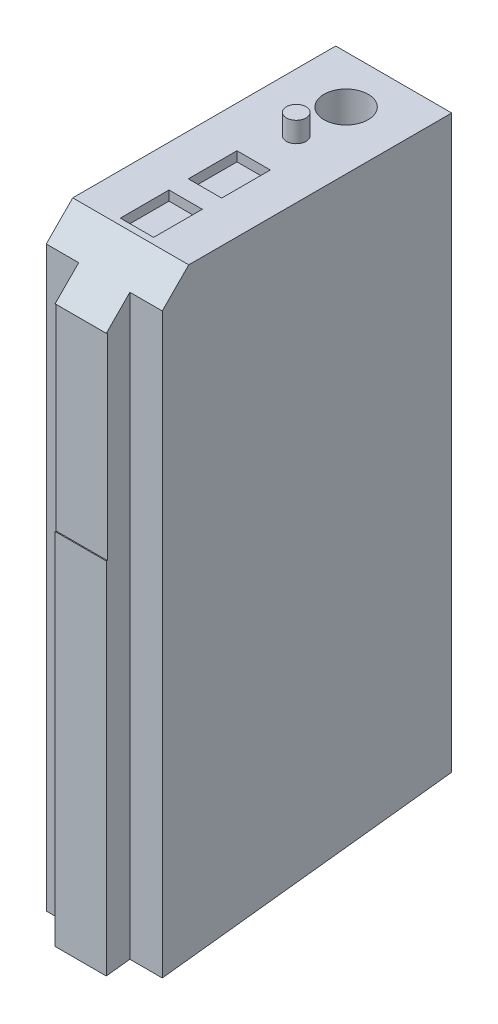
ISO-10303-21;
HEADER;
FILE_DESCRIPTION(('STEP AP214'),'2;1');
FILE_NAME('part.step','',(''),(''),'','','');
FILE_SCHEMA(('AUTOMOTIVE_DESIGN { 1 0 10303 214 1 1 1 1 }'));
ENDSEC;
DATA;
#1=APPLICATION_CONTEXT('core data for automotive mechanical design processes');
#2=APPLICATION_PROTOCOL_DEFINITION('international standard','automotive_design',2000,#1);
#3=PRODUCT_CONTEXT('',#1,'mechanical');
#4=PRODUCT('Part','Part','',(#3));
#5=PRODUCT_RELATED_PRODUCT_CATEGORY('part','',(#4));
#6=PRODUCT_DEFINITION_FORMATION('','',#4);
#7=PRODUCT_DEFINITION_CONTEXT('part definition',#1,'design');
#8=PRODUCT_DEFINITION('design','',#6,#7);
#9=PRODUCT_DEFINITION_SHAPE('','',#8);
#10=(LENGTH_UNIT() NAMED_UNIT(*) SI_UNIT(.MILLI.,.METRE.));
#11=(NAMED_UNIT(*) PLANE_ANGLE_UNIT() SI_UNIT($,.RADIAN.));
#12=(NAMED_UNIT(*) SI_UNIT($,.STERADIAN.) SOLID_ANGLE_UNIT());
#13=UNCERTAINTY_MEASURE_WITH_UNIT(LENGTH_MEASURE(1.E-05),#10,'distance_accuracy_value','');
#14=(GEOMETRIC_REPRESENTATION_CONTEXT(3) GLOBAL_UNCERTAINTY_ASSIGNED_CONTEXT((#13)) GLOBAL_UNIT_ASSIGNED_CONTEXT((#10,
#11,#12)) REPRESENTATION_CONTEXT('',''));
#15=CARTESIAN_POINT('',(0.,0.,0.));
#16=DIRECTION('',(0.,0.,1.));
#17=DIRECTION('',(1.,0.,0.));
#18=AXIS2_PLACEMENT_3D('',#15,#16,#17);
#19=CARTESIAN_POINT('',(24.02,0.,37.585));
#20=DIRECTION('',(0.,0.,-1.));
#21=DIRECTION('',(0.,1.,0.));
#22=AXIS2_PLACEMENT_3D('',#19,#20,#21);
#23=PLANE('',#22);
#24=DIRECTION('',(1.,0.,0.));
#25=VECTOR('',#24,1.);
#26=CARTESIAN_POINT('',(0.,48.635,37.585));
#27=LINE('',#26,#25);
#28=CARTESIAN_POINT('',(6.71,48.635,37.585));
#29=VERTEX_POINT('',#28);
#30=CARTESIAN_POINT('',(17.31,48.635,37.585));
#31=VERTEX_POINT('',#30);
#32=EDGE_CURVE('E273',#29,#31,#27,.T.);
#33=ORIENTED_EDGE('',*,*,#32,.T.);
#34=DIRECTION('',(0.,1.,0.));
#35=VECTOR('',#34,1.);
#36=CARTESIAN_POINT('',(17.31,-66.595,37.585));
#37=LINE('',#36,#35);
#38=CARTESIAN_POINT('',(17.31,48.645,37.585));
#39=VERTEX_POINT('',#38);
#40=EDGE_CURVE('E311',#31,#39,#37,.T.);
#41=ORIENTED_EDGE('',*,*,#40,.T.);
#42=DIRECTION('',(-1.,0.,0.));
#43=VECTOR('',#42,1.);
#44=CARTESIAN_POINT('',(24.02,48.645,37.585));
#45=LINE('',#44,#43);
#46=CARTESIAN_POINT('',(6.71,48.645,37.585));
#47=VERTEX_POINT('',#46);
#48=EDGE_CURVE('E477',#39,#47,#45,.T.);
#49=ORIENTED_EDGE('',*,*,#48,.T.);
#50=DIRECTION('',(0.,1.,0.));
#51=VECTOR('',#50,1.);
#52=CARTESIAN_POINT('',(6.71,-66.595,37.585));
#53=LINE('',#52,#51);
#54=EDGE_CURVE('E302',#29,#47,#53,.T.);
#55=ORIENTED_EDGE('',*,*,#54,.F.);
#56=EDGE_LOOP('',(#33,#41,#49,#55));
#57=FACE_BOUND('',#56,.T.);
#58=ADVANCED_FACE('F44',(#57),#23,.F.);
#59=CARTESIAN_POINT('',(6.71,-66.595,0.));
#60=DIRECTION('',(-1.,0.,0.));
#61=DIRECTION('',(0.,0.,1.));
#62=AXIS2_PLACEMENT_3D('',#59,#60,#61);
#63=PLANE('',#62);
#64=DIRECTION('',(0.,0.,1.));
#65=VECTOR('',#64,1.);
#66=CARTESIAN_POINT('',(6.71,7.81500000000001,37.385));
#67=LINE('',#66,#65);
#68=CARTESIAN_POINT('',(6.71,7.81500000000001,37.385));
#69=VERTEX_POINT('',#68);
#70=CARTESIAN_POINT('',(6.71,7.81500000000001,37.585));
#71=VERTEX_POINT('',#70);
#72=EDGE_CURVE('E266',#69,#71,#67,.T.);
#73=ORIENTED_EDGE('',*,*,#72,.F.);
#74=DIRECTION('',(0.,-1.,0.));
#75=VECTOR('',#74,1.);
#76=CARTESIAN_POINT('',(6.71,0.,37.385));
#77=LINE('',#76,#75);
#78=CARTESIAN_POINT('',(6.71,48.635,37.385));
#79=VERTEX_POINT('',#78);
#80=EDGE_CURVE('E287',#79,#69,#77,.T.);
#81=ORIENTED_EDGE('',*,*,#80,.F.);
#82=DIRECTION('',(0.,0.,1.));
#83=VECTOR('',#82,1.);
#84=CARTESIAN_POINT('',(6.71,48.635,37.385));
#85=LINE('',#84,#83);
#86=EDGE_CURVE('E280',#79,#29,#85,.T.);
#87=ORIENTED_EDGE('',*,*,#86,.T.);
#88=ORIENTED_EDGE('',*,*,#54,.T.);
#89=DIRECTION('',(0.,0.710494872018994,-0.703702378022636));
#90=VECTOR('',#89,1.);
#91=CARTESIAN_POINT('',(6.71,42.8804928089352,43.2943971796779));
#92=LINE('',#91,#90);
#93=CARTESIAN_POINT('',(6.71,53.5721042471042,32.705));
#94=VERTEX_POINT('',#93);
#95=EDGE_CURVE('E334',#47,#94,#92,.T.);
#96=ORIENTED_EDGE('',*,*,#95,.T.);
#97=DIRECTION('',(0.,1.,0.));
#98=VECTOR('',#97,1.);
#99=CARTESIAN_POINT('',(6.71,-66.595,32.705));
#100=LINE('',#99,#98);
#101=CARTESIAN_POINT('',(6.71,-66.0310253047369,32.705));
#102=VERTEX_POINT('',#101);
#103=EDGE_CURVE('E303',#102,#94,#100,.T.);
#104=ORIENTED_EDGE('',*,*,#103,.F.);
#105=DIRECTION('',(0.,0.114804458280303,-0.993388109632366));
#106=VECTOR('',#105,1.);
#107=CARTESIAN_POINT('',(6.71,-61.4308779121369,-7.09947964144279));
#108=LINE('',#107,#106);
#109=CARTESIAN_POINT('',(6.71,-66.595,37.585));
#110=VERTEX_POINT('',#109);
#111=EDGE_CURVE('E337',#110,#102,#108,.T.);
#112=ORIENTED_EDGE('',*,*,#111,.F.);
#113=EDGE_CURVE('E297',#110,#71,#53,.T.);
#114=ORIENTED_EDGE('',*,*,#113,.T.);
#115=EDGE_LOOP('',(#73,#81,#87,#88,#96,#104,#112,#114));
#116=FACE_BOUND('',#115,.T.);
#117=ADVANCED_FACE('F516',(#116),#63,.T.);
#118=CARTESIAN_POINT('',(17.31,-66.595,0.));
#119=DIRECTION('',(1.,0.,0.));
#120=DIRECTION('',(0.,0.,-1.));
#121=AXIS2_PLACEMENT_3D('',#118,#119,#120);
#122=PLANE('',#121);
#123=DIRECTION('',(0.,0.,1.));
#124=VECTOR('',#123,1.);
#125=CARTESIAN_POINT('',(17.31,7.81500000000001,37.385));
#126=LINE('',#125,#124);
#127=CARTESIAN_POINT('',(17.31,7.81500000000001,37.385));
#128=VERTEX_POINT('',#127);
#129=CARTESIAN_POINT('',(17.31,7.81500000000001,37.585));
#130=VERTEX_POINT('',#129);
#131=EDGE_CURVE('E269',#128,#130,#126,.T.);
#132=ORIENTED_EDGE('',*,*,#131,.T.);
#133=CARTESIAN_POINT('',(17.31,-66.595,37.585));
#134=VERTEX_POINT('',#133);
#135=EDGE_CURVE('E307',#134,#130,#37,.T.);
#136=ORIENTED_EDGE('',*,*,#135,.F.);
#137=DIRECTION('',(0.,-0.114804458280303,0.993388109632366));
#138=VECTOR('',#137,1.);
#139=CARTESIAN_POINT('',(17.31,-61.4308779121369,-7.09947964144278));
#140=LINE('',#139,#138);
#141=CARTESIAN_POINT('',(17.31,-66.0310253047369,32.705));
#142=VERTEX_POINT('',#141);
#143=EDGE_CURVE('E330',#142,#134,#140,.T.);
#144=ORIENTED_EDGE('',*,*,#143,.F.);
#145=DIRECTION('',(0.,1.,0.));
#146=VECTOR('',#145,1.);
#147=CARTESIAN_POINT('',(17.31,-66.595,32.705));
#148=LINE('',#147,#146);
#149=CARTESIAN_POINT('',(17.31,53.5721042471042,32.705));
#150=VERTEX_POINT('',#149);
#151=EDGE_CURVE('E296',#142,#150,#148,.T.);
#152=ORIENTED_EDGE('',*,*,#151,.T.);
#153=DIRECTION('',(0.,-0.710494872018994,0.703702378022636));
#154=VECTOR('',#153,1.);
#155=CARTESIAN_POINT('',(17.31,42.8804928089352,43.2943971796779));
#156=LINE('',#155,#154);
#157=EDGE_CURVE('E326',#150,#39,#156,.T.);
#158=ORIENTED_EDGE('',*,*,#157,.T.);
#159=ORIENTED_EDGE('',*,*,#40,.F.);
#160=DIRECTION('',(0.,0.,1.));
#161=VECTOR('',#160,1.);
#162=CARTESIAN_POINT('',(17.31,48.635,37.385));
#163=LINE('',#162,#161);
#164=CARTESIAN_POINT('',(17.31,48.635,37.385));
#165=VERTEX_POINT('',#164);
#166=EDGE_CURVE('E284',#165,#31,#163,.T.);
#167=ORIENTED_EDGE('',*,*,#166,.F.);
#168=DIRECTION('',(0.,1.,0.));
#169=VECTOR('',#168,1.);
#170=CARTESIAN_POINT('',(17.31,0.,37.385));
#171=LINE('',#170,#169);
#172=EDGE_CURVE('E293',#128,#165,#171,.T.);
#173=ORIENTED_EDGE('',*,*,#172,.F.);
#174=EDGE_LOOP('',(#132,#136,#144,#152,#158,#159,#167,#173));
#175=FACE_BOUND('',#174,.T.);
#176=ADVANCED_FACE('F526',(#175),#122,.T.);
#177=CARTESIAN_POINT('',(24.02,-61.4308779121369,-7.09947964144279));
#178=DIRECTION('',(0.,-0.993388109632366,-0.114804458280303));
#179=DIRECTION('',(0.,0.114804458280303,-0.993388109632366));
#180=AXIS2_PLACEMENT_3D('',#177,#178,#179);
#181=PLANE('',#180);
#182=DIRECTION('',(-1.,0.,0.));
#183=VECTOR('',#182,1.);
#184=CARTESIAN_POINT('',(24.02,-66.595,37.585));
#185=LINE('',#184,#183);
#186=EDGE_CURVE('E459',#134,#110,#185,.T.);
#187=ORIENTED_EDGE('',*,*,#186,.T.);
#188=ORIENTED_EDGE('',*,*,#111,.T.);
#189=DIRECTION('',(1.,0.,0.));
#190=VECTOR('',#189,1.);
#191=CARTESIAN_POINT('',(24.02,-66.0310253047369,32.705));
#192=LINE('',#191,#190);
#193=CARTESIAN_POINT('',(0.,-66.0310253047369,32.705));
#194=VERTEX_POINT('',#193);
#195=EDGE_CURVE('E318',#194,#102,#192,.T.);
#196=ORIENTED_EDGE('',*,*,#195,.F.);
#197=DIRECTION('',(0.,-0.114804458280303,0.993388109632366));
#198=VECTOR('',#197,1.);
#199=CARTESIAN_POINT('',(0.,-61.4308779121369,-7.09947964144279));
#200=LINE('',#199,#198);
#201=CARTESIAN_POINT('',(0.,-59.105,-27.225));
#202=VERTEX_POINT('',#201);
#203=EDGE_CURVE('E439',#202,#194,#200,.T.);
#204=ORIENTED_EDGE('',*,*,#203,.F.);
#205=DIRECTION('',(-1.,0.,0.));
#206=VECTOR('',#205,1.);
#207=CARTESIAN_POINT('',(24.02,-59.105,-27.225));
#208=LINE('',#207,#206);
#209=CARTESIAN_POINT('',(24.02,-59.105,-27.225));
#210=VERTEX_POINT('',#209);
#211=EDGE_CURVE('E487',#210,#202,#208,.T.);
#212=ORIENTED_EDGE('',*,*,#211,.F.);
#213=DIRECTION('',(0.,-0.114804458280303,0.993388109632366));
#214=VECTOR('',#213,1.);
#215=CARTESIAN_POINT('',(24.02,-61.4308779121369,-7.09947964144279));
#216=LINE('',#215,#214);
#217=CARTESIAN_POINT('',(24.02,-66.0310253047369,32.705));
#218=VERTEX_POINT('',#217);
#219=EDGE_CURVE('E443',#210,#218,#216,.T.);
#220=ORIENTED_EDGE('',*,*,#219,.T.);
#221=DIRECTION('',(-1.,0.,0.));
#222=VECTOR('',#221,1.);
#223=CARTESIAN_POINT('',(24.02,-66.0310253047369,32.705));
#224=LINE('',#223,#222);
#225=EDGE_CURVE('E68',#218,#142,#224,.T.);
#226=ORIENTED_EDGE('',*,*,#225,.T.);
#227=ORIENTED_EDGE('',*,*,#143,.T.);
#228=EDGE_LOOP('',(#187,#188,#196,#204,#212,#220,#226,#227));
#229=FACE_BOUND('',#228,.T.);
#230=ADVANCED_FACE('F46',(#229),#181,.T.);
#231=CARTESIAN_POINT('',(24.02,42.8804928089352,43.2943971796779));
#232=DIRECTION('',(0.,-0.703702378022636,-0.710494872018994));
#233=DIRECTION('',(0.,0.710494872018994,-0.703702378022636));
#234=AXIS2_PLACEMENT_3D('',#231,#232,#233);
#235=PLANE('',#234);
#236=ORIENTED_EDGE('',*,*,#95,.F.);
#237=ORIENTED_EDGE('',*,*,#48,.F.);
#238=ORIENTED_EDGE('',*,*,#157,.F.);
#239=DIRECTION('',(-1.,0.,0.));
#240=VECTOR('',#239,1.);
#241=CARTESIAN_POINT('',(24.02,53.5721042471042,32.705));
#242=LINE('',#241,#240);
#243=CARTESIAN_POINT('',(24.02,53.5721042471042,32.705));
#244=VERTEX_POINT('',#243);
#245=EDGE_CURVE('E321',#244,#150,#242,.T.);
#246=ORIENTED_EDGE('',*,*,#245,.F.);
#247=DIRECTION('',(0.,-0.710494872018994,0.703702378022636));
#248=VECTOR('',#247,1.);
#249=CARTESIAN_POINT('',(24.02,42.8804928089352,43.2943971796779));
#250=LINE('',#249,#248);
#251=CARTESIAN_POINT('',(24.02,59.105,27.225));
#252=VERTEX_POINT('',#251);
#253=EDGE_CURVE('E455',#252,#244,#250,.T.);
#254=ORIENTED_EDGE('',*,*,#253,.F.);
#255=DIRECTION('',(-1.,0.,0.));
#256=VECTOR('',#255,1.);
#257=CARTESIAN_POINT('',(24.02,59.105,27.225));
#258=LINE('',#257,#256);
#259=CARTESIAN_POINT('',(0.,59.105,27.225));
#260=VERTEX_POINT('',#259);
#261=EDGE_CURVE('E481',#252,#260,#258,.T.);
#262=ORIENTED_EDGE('',*,*,#261,.T.);
#263=DIRECTION('',(0.,-0.710494872018994,0.703702378022636));
#264=VECTOR('',#263,1.);
#265=CARTESIAN_POINT('',(0.,42.8804928089352,43.2943971796779));
#266=LINE('',#265,#264);
#267=CARTESIAN_POINT('',(0.,53.5721042471042,32.705));
#268=VERTEX_POINT('',#267);
#269=EDGE_CURVE('E448',#260,#268,#266,.T.);
#270=ORIENTED_EDGE('',*,*,#269,.T.);
#271=DIRECTION('',(1.,0.,0.));
#272=VECTOR('',#271,1.);
#273=CARTESIAN_POINT('',(24.02,53.5721042471042,32.705));
#274=LINE('',#273,#272);
#275=EDGE_CURVE('E301',#268,#94,#274,.T.);
#276=ORIENTED_EDGE('',*,*,#275,.T.);
#277=EDGE_LOOP('',(#236,#237,#238,#246,#254,#262,#270,#276));
#278=FACE_BOUND('',#277,.T.);
#279=ADVANCED_FACE('F501',(#278),#235,.F.);
#280=ORIENTED_EDGE('',*,*,#135,.T.);
#281=DIRECTION('',(1.,0.,0.));
#282=VECTOR('',#281,1.);
#283=CARTESIAN_POINT('',(0.,7.81500000000001,37.585));
#284=LINE('',#283,#282);
#285=EDGE_CURVE('E256',#71,#130,#284,.T.);
#286=ORIENTED_EDGE('',*,*,#285,.F.);
#287=ORIENTED_EDGE('',*,*,#113,.F.);
#288=ORIENTED_EDGE('',*,*,#186,.F.);
#289=EDGE_LOOP('',(#280,#286,#287,#288));
#290=FACE_BOUND('',#289,.T.);
#291=ADVANCED_FACE('F544',(#290),#23,.F.);
#292=CARTESIAN_POINT('',(24.02,0.,0.));
#293=DIRECTION('',(1.,0.,0.));
#294=DIRECTION('',(0.,0.,-1.));
#295=AXIS2_PLACEMENT_3D('',#292,#293,#294);
#296=PLANE('',#295);
#297=ORIENTED_EDGE('',*,*,#253,.T.);
#298=DIRECTION('',(0.,-1.,0.));
#299=VECTOR('',#298,1.);
#300=CARTESIAN_POINT('',(24.02,0.,32.705));
#301=LINE('',#300,#299);
#302=EDGE_CURVE('E11',#244,#218,#301,.T.);
#303=ORIENTED_EDGE('',*,*,#302,.T.);
#304=ORIENTED_EDGE('',*,*,#219,.F.);
#305=DIRECTION('',(0.,1.,0.));
#306=VECTOR('',#305,1.);
#307=CARTESIAN_POINT('',(24.02,0.,-27.225));
#308=LINE('',#307,#306);
#309=CARTESIAN_POINT('',(24.02,59.105,-27.225));
#310=VERTEX_POINT('',#309);
#311=EDGE_CURVE('E447',#210,#310,#308,.T.);
#312=ORIENTED_EDGE('',*,*,#311,.T.);
#313=DIRECTION('',(0.,0.,-1.));
#314=VECTOR('',#313,1.);
#315=CARTESIAN_POINT('',(24.02,59.105,0.));
#316=LINE('',#315,#314);
#317=EDGE_CURVE('E451',#252,#310,#316,.T.);
#318=ORIENTED_EDGE('',*,*,#317,.F.);
#319=EDGE_LOOP('',(#297,#303,#304,#312,#318));
#320=FACE_BOUND('',#319,.T.);
#321=ADVANCED_FACE('F528',(#320),#296,.T.);
#322=CARTESIAN_POINT('',(24.02,59.105,0.));
#323=DIRECTION('',(0.,1.,0.));
#324=DIRECTION('',(0.,0.,1.));
#325=AXIS2_PLACEMENT_3D('',#322,#323,#324);
#326=PLANE('',#325);
#327=DIRECTION('',(1.,0.,0.));
#328=VECTOR('',#327,1.);
#329=CARTESIAN_POINT('',(0.,59.105,11.855));
#330=LINE('',#329,#328);
#331=CARTESIAN_POINT('',(8.56,59.105,11.855));
#332=VERTEX_POINT('',#331);
#333=CARTESIAN_POINT('',(15.46,59.105,11.855));
#334=VERTEX_POINT('',#333);
#335=EDGE_CURVE('E358',#332,#334,#330,.T.);
#336=ORIENTED_EDGE('',*,*,#335,.F.);
#337=DIRECTION('',(0.,0.,-1.));
#338=VECTOR('',#337,1.);
#339=CARTESIAN_POINT('',(8.56,59.105,0.));
#340=LINE('',#339,#338);
#341=CARTESIAN_POINT('',(8.56,59.105,1.775));
#342=VERTEX_POINT('',#341);
#343=EDGE_CURVE('E347',#332,#342,#340,.T.);
#344=ORIENTED_EDGE('',*,*,#343,.T.);
#345=DIRECTION('',(1.,0.,0.));
#346=VECTOR('',#345,1.);
#347=CARTESIAN_POINT('',(0.,59.105,1.775));
#348=LINE('',#347,#346);
#349=CARTESIAN_POINT('',(15.46,59.105,1.775));
#350=VERTEX_POINT('',#349);
#351=EDGE_CURVE('E366',#342,#350,#348,.T.);
#352=ORIENTED_EDGE('',*,*,#351,.T.);
#353=DIRECTION('',(0.,0.,-1.));
#354=VECTOR('',#353,1.);
#355=CARTESIAN_POINT('',(15.46,59.105,0.));
#356=LINE('',#355,#354);
#357=EDGE_CURVE('E361',#334,#350,#356,.T.);
#358=ORIENTED_EDGE('',*,*,#357,.F.);
#359=EDGE_LOOP('',(#336,#344,#352,#358));
#360=FACE_BOUND('',#359,.T.);
#361=CARTESIAN_POINT('',(12.01,59.105,-7.04));
#362=DIRECTION('',(0.,1.,0.));
#363=DIRECTION('',(0.,0.,1.));
#364=AXIS2_PLACEMENT_3D('',#361,#362,#363);
#365=CIRCLE('',#364,2.025);
#366=CARTESIAN_POINT('',(12.01,59.105,-5.015));
#367=VERTEX_POINT('',#366);
#368=EDGE_CURVE('E376',#367,#367,#365,.T.);
#369=ORIENTED_EDGE('',*,*,#368,.F.);
#370=EDGE_LOOP('',(#369));
#371=FACE_BOUND('',#370,.T.);
#372=CARTESIAN_POINT('',(12.01,59.105,-17.36));
#373=DIRECTION('',(0.,1.,0.));
#374=DIRECTION('',(0.,0.,1.));
#375=AXIS2_PLACEMENT_3D('',#372,#373,#374);
#376=CIRCLE('',#375,4.575);
#377=CARTESIAN_POINT('',(12.01,59.105,-12.785));
#378=VERTEX_POINT('',#377);
#379=EDGE_CURVE('E431',#378,#378,#376,.T.);
#380=ORIENTED_EDGE('',*,*,#379,.F.);
#381=EDGE_LOOP('',(#380));
#382=FACE_BOUND('',#381,.T.);
#383=DIRECTION('',(0.,0.,-1.));
#384=VECTOR('',#383,1.);
#385=CARTESIAN_POINT('',(0.,59.105,0.));
#386=LINE('',#385,#384);
#387=CARTESIAN_POINT('',(0.,59.105,-27.225));
#388=VERTEX_POINT('',#387);
#389=EDGE_CURVE('E467',#260,#388,#386,.T.);
#390=ORIENTED_EDGE('',*,*,#389,.F.);
#391=ORIENTED_EDGE('',*,*,#261,.F.);
#392=ORIENTED_EDGE('',*,*,#317,.T.);
#393=DIRECTION('',(-1.,0.,0.));
#394=VECTOR('',#393,1.);
#395=CARTESIAN_POINT('',(24.02,59.105,-27.225));
#396=LINE('',#395,#394);
#397=EDGE_CURVE('E484',#310,#388,#396,.T.);
#398=ORIENTED_EDGE('',*,*,#397,.T.);
#399=EDGE_LOOP('',(#390,#391,#392,#398));
#400=FACE_BOUND('',#399,.T.);
#401=DIRECTION('',(0.,0.,-1.));
#402=VECTOR('',#401,1.);
#403=CARTESIAN_POINT('',(8.56,59.105,0.));
#404=LINE('',#403,#402);
#405=CARTESIAN_POINT('',(8.56,59.105,25.935));
#406=VERTEX_POINT('',#405);
#407=CARTESIAN_POINT('',(8.56,59.105,15.855));
#408=VERTEX_POINT('',#407);
#409=EDGE_CURVE('E405',#406,#408,#404,.T.);
#410=ORIENTED_EDGE('',*,*,#409,.T.);
#411=DIRECTION('',(1.,0.,0.));
#412=VECTOR('',#411,1.);
#413=CARTESIAN_POINT('',(0.,59.105,15.855));
#414=LINE('',#413,#412);
#415=CARTESIAN_POINT('',(15.46,59.105,15.855));
#416=VERTEX_POINT('',#415);
#417=EDGE_CURVE('E341',#408,#416,#414,.T.);
#418=ORIENTED_EDGE('',*,*,#417,.T.);
#419=DIRECTION('',(0.,0.,-1.));
#420=VECTOR('',#419,1.);
#421=CARTESIAN_POINT('',(15.46,59.105,0.));
#422=LINE('',#421,#420);
#423=CARTESIAN_POINT('',(15.46,59.105,25.935));
#424=VERTEX_POINT('',#423);
#425=EDGE_CURVE('E390',#424,#416,#422,.T.);
#426=ORIENTED_EDGE('',*,*,#425,.F.);
#427=DIRECTION('',(1.,0.,0.));
#428=VECTOR('',#427,1.);
#429=CARTESIAN_POINT('',(0.,59.105,25.935));
#430=LINE('',#429,#428);
#431=EDGE_CURVE('E409',#406,#424,#430,.T.);
#432=ORIENTED_EDGE('',*,*,#431,.F.);
#433=EDGE_LOOP('',(#410,#418,#426,#432));
#434=FACE_BOUND('',#433,.T.);
#435=ADVANCED_FACE('F506',(#360,#371,#382,#400,#434),#326,.T.);
#436=CARTESIAN_POINT('',(24.02,0.,-27.225));
#437=DIRECTION('',(0.,0.,1.));
#438=DIRECTION('',(1.,0.,0.));
#439=AXIS2_PLACEMENT_3D('',#436,#437,#438);
#440=PLANE('',#439);
#441=DIRECTION('',(0.,1.,0.));
#442=VECTOR('',#441,1.);
#443=CARTESIAN_POINT('',(0.,0.,-27.225));
#444=LINE('',#443,#442);
#445=EDGE_CURVE('E463',#202,#388,#444,.T.);
#446=ORIENTED_EDGE('',*,*,#445,.T.);
#447=ORIENTED_EDGE('',*,*,#397,.F.);
#448=ORIENTED_EDGE('',*,*,#311,.F.);
#449=ORIENTED_EDGE('',*,*,#211,.T.);
#450=EDGE_LOOP('',(#446,#447,#448,#449));
#451=FACE_BOUND('',#450,.T.);
#452=ADVANCED_FACE('F530',(#451),#440,.F.);
#453=CARTESIAN_POINT('',(0.,0.,0.));
#454=DIRECTION('',(1.,0.,0.));
#455=DIRECTION('',(0.,0.,-1.));
#456=AXIS2_PLACEMENT_3D('',#453,#454,#455);
#457=PLANE('',#456);
#458=DIRECTION('',(0.,1.,0.));
#459=VECTOR('',#458,1.);
#460=CARTESIAN_POINT('',(0.,0.,21.535));
#461=LINE('',#460,#459);
#462=CARTESIAN_POINT('',(0.,42.315,21.535));
#463=VERTEX_POINT('',#462);
#464=CARTESIAN_POINT('',(0.,47.925,21.535));
#465=VERTEX_POINT('',#464);
#466=EDGE_CURVE('E247',#463,#465,#461,.T.);
#467=ORIENTED_EDGE('',*,*,#466,.F.);
#468=DIRECTION('',(0.,0.,1.));
#469=VECTOR('',#468,1.);
#470=CARTESIAN_POINT('',(0.,42.315,0.));
#471=LINE('',#470,#469);
#472=CARTESIAN_POINT('',(0.,42.315,14.855));
#473=VERTEX_POINT('',#472);
#474=EDGE_CURVE('E60',#473,#463,#471,.T.);
#475=ORIENTED_EDGE('',*,*,#474,.F.);
#476=DIRECTION('',(0.,1.,0.));
#477=VECTOR('',#476,1.);
#478=CARTESIAN_POINT('',(0.,0.,14.855));
#479=LINE('',#478,#477);
#480=CARTESIAN_POINT('',(0.,47.925,14.855));
#481=VERTEX_POINT('',#480);
#482=EDGE_CURVE('E234',#473,#481,#479,.T.);
#483=ORIENTED_EDGE('',*,*,#482,.T.);
#484=DIRECTION('',(0.,0.,1.));
#485=VECTOR('',#484,1.);
#486=CARTESIAN_POINT('',(0.,47.925,0.));
#487=LINE('',#486,#485);
#488=EDGE_CURVE('E238',#481,#465,#487,.T.);
#489=ORIENTED_EDGE('',*,*,#488,.T.);
#490=EDGE_LOOP('',(#467,#475,#483,#489));
#491=FACE_BOUND('',#490,.T.);
#492=ORIENTED_EDGE('',*,*,#203,.T.);
#493=DIRECTION('',(0.,1.,0.));
#494=VECTOR('',#493,1.);
#495=CARTESIAN_POINT('',(0.,0.,32.705));
#496=LINE('',#495,#494);
#497=EDGE_CURVE('E53',#194,#268,#496,.T.);
#498=ORIENTED_EDGE('',*,*,#497,.T.);
#499=ORIENTED_EDGE('',*,*,#269,.F.);
#500=ORIENTED_EDGE('',*,*,#389,.T.);
#501=ORIENTED_EDGE('',*,*,#445,.F.);
#502=EDGE_LOOP('',(#492,#498,#499,#500,#501));
#503=FACE_BOUND('',#502,.T.);
#504=ADVANCED_FACE('F493',(#491,#503),#457,.F.);
#505=CARTESIAN_POINT('',(12.01,49.105,-17.36));
#506=DIRECTION('',(0.,1.,0.));
#507=DIRECTION('',(0.,0.,1.));
#508=AXIS2_PLACEMENT_3D('',#505,#506,#507);
#509=CYLINDRICAL_SURFACE('',#508,4.575);
#510=CARTESIAN_POINT('',(12.01,49.105,-17.36));
#511=DIRECTION('',(0.,1.,0.));
#512=DIRECTION('',(0.,0.,1.));
#513=AXIS2_PLACEMENT_3D('',#510,#511,#512);
#514=CIRCLE('',#513,4.575);
#515=CARTESIAN_POINT('',(12.01,49.105,-12.785));
#516=VERTEX_POINT('',#515);
#517=EDGE_CURVE('E435',#516,#516,#514,.T.);
#518=ORIENTED_EDGE('',*,*,#517,.F.);
#519=EDGE_LOOP('',(#518));
#520=FACE_BOUND('',#519,.T.);
#521=ORIENTED_EDGE('',*,*,#379,.T.);
#522=EDGE_LOOP('',(#521));
#523=FACE_BOUND('',#522,.T.);
#524=ADVANCED_FACE('F537',(#520,#523),#509,.F.);
#525=CARTESIAN_POINT('',(0.,49.105,0.));
#526=DIRECTION('',(0.,1.,0.));
#527=DIRECTION('',(0.,0.,1.));
#528=AXIS2_PLACEMENT_3D('',#525,#526,#527);
#529=PLANE('',#528);
#530=ORIENTED_EDGE('',*,*,#517,.T.);
#531=EDGE_LOOP('',(#530));
#532=FACE_BOUND('',#531,.T.);
#533=ADVANCED_FACE('F633',(#532),#529,.T.);
#534=CARTESIAN_POINT('',(12.01,63.315,-7.04));
#535=DIRECTION('',(0.,-1.,0.));
#536=DIRECTION('',(0.,0.,-1.));
#537=AXIS2_PLACEMENT_3D('',#534,#535,#536);
#538=CYLINDRICAL_SURFACE('',#537,2.025);
#539=CARTESIAN_POINT('',(12.01,63.315,-7.04));
#540=DIRECTION('',(0.,1.,0.));
#541=DIRECTION('',(0.,0.,1.));
#542=AXIS2_PLACEMENT_3D('',#539,#540,#541);
#543=CIRCLE('',#542,2.025);
#544=CARTESIAN_POINT('',(12.01,63.315,-5.015));
#545=VERTEX_POINT('',#544);
#546=EDGE_CURVE('E427',#545,#545,#543,.T.);
#547=ORIENTED_EDGE('',*,*,#546,.F.);
#548=EDGE_LOOP('',(#547));
#549=FACE_BOUND('',#548,.T.);
#550=ORIENTED_EDGE('',*,*,#368,.T.);
#551=EDGE_LOOP('',(#550));
#552=FACE_BOUND('',#551,.T.);
#553=ADVANCED_FACE('F629',(#549,#552),#538,.T.);
#554=CARTESIAN_POINT('',(0.,63.315,0.));
#555=DIRECTION('',(0.,1.,0.));
#556=DIRECTION('',(0.,0.,1.));
#557=AXIS2_PLACEMENT_3D('',#554,#555,#556);
#558=PLANE('',#557);
#559=ORIENTED_EDGE('',*,*,#546,.T.);
#560=EDGE_LOOP('',(#559));
#561=FACE_BOUND('',#560,.T.);
#562=ADVANCED_FACE('F625',(#561),#558,.T.);
#563=CARTESIAN_POINT('',(0.,57.105,15.855));
#564=DIRECTION('',(0.,0.,1.));
#565=DIRECTION('',(1.,0.,0.));
#566=AXIS2_PLACEMENT_3D('',#563,#564,#565);
#567=PLANE('',#566);
#568=ORIENTED_EDGE('',*,*,#417,.F.);
#569=DIRECTION('',(0.,1.,0.));
#570=VECTOR('',#569,1.);
#571=CARTESIAN_POINT('',(8.56,57.105,15.855));
#572=LINE('',#571,#570);
#573=CARTESIAN_POINT('',(8.56,57.105,15.855));
#574=VERTEX_POINT('',#573);
#575=EDGE_CURVE('E401',#574,#408,#572,.T.);
#576=ORIENTED_EDGE('',*,*,#575,.F.);
#577=DIRECTION('',(1.,0.,0.));
#578=VECTOR('',#577,1.);
#579=CARTESIAN_POINT('',(0.,57.105,15.855));
#580=LINE('',#579,#578);
#581=CARTESIAN_POINT('',(15.46,57.105,15.855));
#582=VERTEX_POINT('',#581);
#583=EDGE_CURVE('E386',#574,#582,#580,.T.);
#584=ORIENTED_EDGE('',*,*,#583,.T.);
#585=DIRECTION('',(0.,1.,0.));
#586=VECTOR('',#585,1.);
#587=CARTESIAN_POINT('',(15.46,57.105,15.855));
#588=LINE('',#587,#586);
#589=EDGE_CURVE('E362',#582,#416,#588,.T.);
#590=ORIENTED_EDGE('',*,*,#589,.T.);
#591=EDGE_LOOP('',(#568,#576,#584,#590));
#592=FACE_BOUND('',#591,.T.);
#593=ADVANCED_FACE('F615',(#592),#567,.T.);
#594=CARTESIAN_POINT('',(15.46,57.105,0.));
#595=DIRECTION('',(1.,0.,0.));
#596=DIRECTION('',(0.,0.,-1.));
#597=AXIS2_PLACEMENT_3D('',#594,#595,#596);
#598=PLANE('',#597);
#599=ORIENTED_EDGE('',*,*,#425,.T.);
#600=ORIENTED_EDGE('',*,*,#589,.F.);
#601=DIRECTION('',(0.,0.,-1.));
#602=VECTOR('',#601,1.);
#603=CARTESIAN_POINT('',(15.46,57.105,0.));
#604=LINE('',#603,#602);
#605=CARTESIAN_POINT('',(15.46,57.105,25.935));
#606=VERTEX_POINT('',#605);
#607=EDGE_CURVE('E397',#606,#582,#604,.T.);
#608=ORIENTED_EDGE('',*,*,#607,.F.);
#609=DIRECTION('',(0.,1.,0.));
#610=VECTOR('',#609,1.);
#611=CARTESIAN_POINT('',(15.46,57.105,25.935));
#612=LINE('',#611,#610);
#613=EDGE_CURVE('E418',#606,#424,#612,.T.);
#614=ORIENTED_EDGE('',*,*,#613,.T.);
#615=EDGE_LOOP('',(#599,#600,#608,#614));
#616=FACE_BOUND('',#615,.T.);
#617=ADVANCED_FACE('F611',(#616),#598,.F.);
#618=CARTESIAN_POINT('',(0.,57.105,25.935));
#619=DIRECTION('',(0.,0.,1.));
#620=DIRECTION('',(1.,0.,0.));
#621=AXIS2_PLACEMENT_3D('',#618,#619,#620);
#622=PLANE('',#621);
#623=ORIENTED_EDGE('',*,*,#431,.T.);
#624=ORIENTED_EDGE('',*,*,#613,.F.);
#625=DIRECTION('',(1.,0.,0.));
#626=VECTOR('',#625,1.);
#627=CARTESIAN_POINT('',(0.,57.105,25.935));
#628=LINE('',#627,#626);
#629=CARTESIAN_POINT('',(8.56,57.105,25.935));
#630=VERTEX_POINT('',#629);
#631=EDGE_CURVE('E393',#630,#606,#628,.T.);
#632=ORIENTED_EDGE('',*,*,#631,.F.);
#633=DIRECTION('',(0.,1.,0.));
#634=VECTOR('',#633,1.);
#635=CARTESIAN_POINT('',(8.56,57.105,25.935));
#636=LINE('',#635,#634);
#637=EDGE_CURVE('E421',#630,#406,#636,.T.);
#638=ORIENTED_EDGE('',*,*,#637,.T.);
#639=EDGE_LOOP('',(#623,#624,#632,#638));
#640=FACE_BOUND('',#639,.T.);
#641=ADVANCED_FACE('F614',(#640),#622,.F.);
#642=CARTESIAN_POINT('',(8.56,57.105,0.));
#643=DIRECTION('',(1.,0.,0.));
#644=DIRECTION('',(0.,0.,-1.));
#645=AXIS2_PLACEMENT_3D('',#642,#643,#644);
#646=PLANE('',#645);
#647=ORIENTED_EDGE('',*,*,#409,.F.);
#648=ORIENTED_EDGE('',*,*,#637,.F.);
#649=DIRECTION('',(0.,0.,-1.));
#650=VECTOR('',#649,1.);
#651=CARTESIAN_POINT('',(8.56,57.105,0.));
#652=LINE('',#651,#650);
#653=EDGE_CURVE('E389',#630,#574,#652,.T.);
#654=ORIENTED_EDGE('',*,*,#653,.T.);
#655=ORIENTED_EDGE('',*,*,#575,.T.);
#656=EDGE_LOOP('',(#647,#648,#654,#655));
#657=FACE_BOUND('',#656,.T.);
#658=ADVANCED_FACE('F609',(#657),#646,.T.);
#659=CARTESIAN_POINT('',(0.,57.105,0.));
#660=DIRECTION('',(0.,1.,0.));
#661=DIRECTION('',(0.,0.,1.));
#662=AXIS2_PLACEMENT_3D('',#659,#660,#661);
#663=PLANE('',#662);
#664=ORIENTED_EDGE('',*,*,#583,.F.);
#665=ORIENTED_EDGE('',*,*,#653,.F.);
#666=ORIENTED_EDGE('',*,*,#631,.T.);
#667=ORIENTED_EDGE('',*,*,#607,.T.);
#668=EDGE_LOOP('',(#664,#665,#666,#667));
#669=FACE_BOUND('',#668,.T.);
#670=ADVANCED_FACE('F605',(#669),#663,.T.);
#671=CARTESIAN_POINT('',(0.,57.105,11.855));
#672=DIRECTION('',(0.,0.,1.));
#673=DIRECTION('',(1.,0.,0.));
#674=AXIS2_PLACEMENT_3D('',#671,#672,#673);
#675=PLANE('',#674);
#676=ORIENTED_EDGE('',*,*,#335,.T.);
#677=DIRECTION('',(0.,1.,0.));
#678=VECTOR('',#677,1.);
#679=CARTESIAN_POINT('',(15.46,57.105,11.855));
#680=LINE('',#679,#678);
#681=CARTESIAN_POINT('',(15.46,57.105,11.855));
#682=VERTEX_POINT('',#681);
#683=EDGE_CURVE('E357',#682,#334,#680,.T.);
#684=ORIENTED_EDGE('',*,*,#683,.F.);
#685=DIRECTION('',(1.,0.,0.));
#686=VECTOR('',#685,1.);
#687=CARTESIAN_POINT('',(0.,57.105,11.855));
#688=LINE('',#687,#686);
#689=CARTESIAN_POINT('',(8.56,57.105,11.855));
#690=VERTEX_POINT('',#689);
#691=EDGE_CURVE('E342',#690,#682,#688,.T.);
#692=ORIENTED_EDGE('',*,*,#691,.F.);
#693=DIRECTION('',(0.,1.,0.));
#694=VECTOR('',#693,1.);
#695=CARTESIAN_POINT('',(8.56,57.105,11.855));
#696=LINE('',#695,#694);
#697=EDGE_CURVE('E373',#690,#332,#696,.T.);
#698=ORIENTED_EDGE('',*,*,#697,.T.);
#699=EDGE_LOOP('',(#676,#684,#692,#698));
#700=FACE_BOUND('',#699,.T.);
#701=ADVANCED_FACE('F595',(#700),#675,.F.);
#702=CARTESIAN_POINT('',(8.56,57.105,0.));
#703=DIRECTION('',(1.,0.,0.));
#704=DIRECTION('',(0.,0.,-1.));
#705=AXIS2_PLACEMENT_3D('',#702,#703,#704);
#706=PLANE('',#705);
#707=ORIENTED_EDGE('',*,*,#343,.F.);
#708=ORIENTED_EDGE('',*,*,#697,.F.);
#709=DIRECTION('',(0.,0.,-1.));
#710=VECTOR('',#709,1.);
#711=CARTESIAN_POINT('',(8.56,57.105,0.));
#712=LINE('',#711,#710);
#713=CARTESIAN_POINT('',(8.56,57.105,1.775));
#714=VERTEX_POINT('',#713);
#715=EDGE_CURVE('E354',#690,#714,#712,.T.);
#716=ORIENTED_EDGE('',*,*,#715,.T.);
#717=DIRECTION('',(0.,1.,0.));
#718=VECTOR('',#717,1.);
#719=CARTESIAN_POINT('',(8.56,57.105,1.775));
#720=LINE('',#719,#718);
#721=EDGE_CURVE('E377',#714,#342,#720,.T.);
#722=ORIENTED_EDGE('',*,*,#721,.T.);
#723=EDGE_LOOP('',(#707,#708,#716,#722));
#724=FACE_BOUND('',#723,.T.);
#725=ADVANCED_FACE('F591',(#724),#706,.T.);
#726=CARTESIAN_POINT('',(0.,57.105,1.775));
#727=DIRECTION('',(0.,0.,1.));
#728=DIRECTION('',(1.,0.,0.));
#729=AXIS2_PLACEMENT_3D('',#726,#727,#728);
#730=PLANE('',#729);
#731=ORIENTED_EDGE('',*,*,#351,.F.);
#732=ORIENTED_EDGE('',*,*,#721,.F.);
#733=DIRECTION('',(1.,0.,0.));
#734=VECTOR('',#733,1.);
#735=CARTESIAN_POINT('',(0.,57.105,1.775));
#736=LINE('',#735,#734);
#737=CARTESIAN_POINT('',(15.46,57.105,1.775));
#738=VERTEX_POINT('',#737);
#739=EDGE_CURVE('E351',#714,#738,#736,.T.);
#740=ORIENTED_EDGE('',*,*,#739,.T.);
#741=DIRECTION('',(0.,1.,0.));
#742=VECTOR('',#741,1.);
#743=CARTESIAN_POINT('',(15.46,57.105,1.775));
#744=LINE('',#743,#742);
#745=EDGE_CURVE('E380',#738,#350,#744,.T.);
#746=ORIENTED_EDGE('',*,*,#745,.T.);
#747=EDGE_LOOP('',(#731,#732,#740,#746));
#748=FACE_BOUND('',#747,.T.);
#749=ADVANCED_FACE('F594',(#748),#730,.T.);
#750=CARTESIAN_POINT('',(15.46,57.105,0.));
#751=DIRECTION('',(1.,0.,0.));
#752=DIRECTION('',(0.,0.,-1.));
#753=AXIS2_PLACEMENT_3D('',#750,#751,#752);
#754=PLANE('',#753);
#755=ORIENTED_EDGE('',*,*,#357,.T.);
#756=ORIENTED_EDGE('',*,*,#745,.F.);
#757=DIRECTION('',(0.,0.,-1.));
#758=VECTOR('',#757,1.);
#759=CARTESIAN_POINT('',(15.46,57.105,0.));
#760=LINE('',#759,#758);
#761=EDGE_CURVE('E346',#682,#738,#760,.T.);
#762=ORIENTED_EDGE('',*,*,#761,.F.);
#763=ORIENTED_EDGE('',*,*,#683,.T.);
#764=EDGE_LOOP('',(#755,#756,#762,#763));
#765=FACE_BOUND('',#764,.T.);
#766=ADVANCED_FACE('F589',(#765),#754,.F.);
#767=CARTESIAN_POINT('',(0.,57.105,0.));
#768=DIRECTION('',(0.,1.,0.));
#769=DIRECTION('',(0.,0.,1.));
#770=AXIS2_PLACEMENT_3D('',#767,#768,#769);
#771=PLANE('',#770);
#772=ORIENTED_EDGE('',*,*,#691,.T.);
#773=ORIENTED_EDGE('',*,*,#761,.T.);
#774=ORIENTED_EDGE('',*,*,#739,.F.);
#775=ORIENTED_EDGE('',*,*,#715,.F.);
#776=EDGE_LOOP('',(#772,#773,#774,#775));
#777=FACE_BOUND('',#776,.T.);
#778=ADVANCED_FACE('F581',(#777),#771,.T.);
#779=CARTESIAN_POINT('',(0.,-66.595,32.705));
#780=DIRECTION('',(0.,0.,-1.));
#781=DIRECTION('',(-1.,0.,0.));
#782=AXIS2_PLACEMENT_3D('',#779,#780,#781);
#783=PLANE('',#782);
#784=ORIENTED_EDGE('',*,*,#195,.T.);
#785=ORIENTED_EDGE('',*,*,#103,.T.);
#786=ORIENTED_EDGE('',*,*,#275,.F.);
#787=ORIENTED_EDGE('',*,*,#497,.F.);
#788=EDGE_LOOP('',(#784,#785,#786,#787));
#789=FACE_BOUND('',#788,.T.);
#790=ADVANCED_FACE('F513',(#789),#783,.F.);
#791=CARTESIAN_POINT('',(0.,-66.595,32.705));
#792=DIRECTION('',(0.,0.,1.));
#793=DIRECTION('',(1.,0.,0.));
#794=AXIS2_PLACEMENT_3D('',#791,#792,#793);
#795=PLANE('',#794);
#796=ORIENTED_EDGE('',*,*,#302,.F.);
#797=ORIENTED_EDGE('',*,*,#245,.T.);
#798=ORIENTED_EDGE('',*,*,#151,.F.);
#799=ORIENTED_EDGE('',*,*,#225,.F.);
#800=EDGE_LOOP('',(#796,#797,#798,#799));
#801=FACE_BOUND('',#800,.T.);
#802=ADVANCED_FACE('F576',(#801),#795,.T.);
#803=CARTESIAN_POINT('',(0.,0.,37.385));
#804=DIRECTION('',(0.,0.,1.));
#805=DIRECTION('',(1.,0.,0.));
#806=AXIS2_PLACEMENT_3D('',#803,#804,#805);
#807=PLANE('',#806);
#808=ORIENTED_EDGE('',*,*,#172,.T.);
#809=DIRECTION('',(1.,0.,0.));
#810=VECTOR('',#809,1.);
#811=CARTESIAN_POINT('',(0.,48.635,37.385));
#812=LINE('',#811,#810);
#813=EDGE_CURVE('E276',#79,#165,#812,.T.);
#814=ORIENTED_EDGE('',*,*,#813,.F.);
#815=ORIENTED_EDGE('',*,*,#80,.T.);
#816=DIRECTION('',(1.,0.,0.));
#817=VECTOR('',#816,1.);
#818=CARTESIAN_POINT('',(0.,7.81500000000001,37.385));
#819=LINE('',#818,#817);
#820=EDGE_CURVE('E262',#69,#128,#819,.T.);
#821=ORIENTED_EDGE('',*,*,#820,.T.);
#822=EDGE_LOOP('',(#808,#814,#815,#821));
#823=FACE_BOUND('',#822,.T.);
#824=ADVANCED_FACE('F564',(#823),#807,.T.);
#825=CARTESIAN_POINT('',(0.,48.635,37.385));
#826=DIRECTION('',(0.,-1.,0.));
#827=DIRECTION('',(0.,0.,-1.));
#828=AXIS2_PLACEMENT_3D('',#825,#826,#827);
#829=PLANE('',#828);
#830=ORIENTED_EDGE('',*,*,#32,.F.);
#831=ORIENTED_EDGE('',*,*,#86,.F.);
#832=ORIENTED_EDGE('',*,*,#813,.T.);
#833=ORIENTED_EDGE('',*,*,#166,.T.);
#834=EDGE_LOOP('',(#830,#831,#832,#833));
#835=FACE_BOUND('',#834,.T.);
#836=ADVANCED_FACE('F568',(#835),#829,.T.);
#837=CARTESIAN_POINT('',(0.,7.81500000000001,37.385));
#838=DIRECTION('',(0.,-1.,0.));
#839=DIRECTION('',(0.,0.,-1.));
#840=AXIS2_PLACEMENT_3D('',#837,#838,#839);
#841=PLANE('',#840);
#842=ORIENTED_EDGE('',*,*,#285,.T.);
#843=ORIENTED_EDGE('',*,*,#131,.F.);
#844=ORIENTED_EDGE('',*,*,#820,.F.);
#845=ORIENTED_EDGE('',*,*,#72,.T.);
#846=EDGE_LOOP('',(#842,#843,#844,#845));
#847=FACE_BOUND('',#846,.T.);
#848=ADVANCED_FACE('F562',(#847),#841,.F.);
#849=CARTESIAN_POINT('',(2.08,42.315,0.));
#850=DIRECTION('',(0.,-1.,0.));
#851=DIRECTION('',(0.,0.,-1.));
#852=AXIS2_PLACEMENT_3D('',#849,#850,#851);
#853=PLANE('',#852);
#854=ORIENTED_EDGE('',*,*,#474,.T.);
#855=DIRECTION('',(-1.,0.,0.));
#856=VECTOR('',#855,1.);
#857=CARTESIAN_POINT('',(2.08,42.315,21.535));
#858=LINE('',#857,#856);
#859=CARTESIAN_POINT('',(2.08,42.315,21.535));
#860=VERTEX_POINT('',#859);
#861=EDGE_CURVE('E210',#860,#463,#858,.T.);
#862=ORIENTED_EDGE('',*,*,#861,.F.);
#863=DIRECTION('',(0.,0.,1.));
#864=VECTOR('',#863,1.);
#865=CARTESIAN_POINT('',(2.08,42.315,0.));
#866=LINE('',#865,#864);
#867=CARTESIAN_POINT('',(2.08,42.315,14.855));
#868=VERTEX_POINT('',#867);
#869=EDGE_CURVE('E214',#868,#860,#866,.T.);
#870=ORIENTED_EDGE('',*,*,#869,.F.);
#871=DIRECTION('',(-1.,0.,0.));
#872=VECTOR('',#871,1.);
#873=CARTESIAN_POINT('',(2.08,42.315,14.855));
#874=LINE('',#873,#872);
#875=EDGE_CURVE('E253',#868,#473,#874,.T.);
#876=ORIENTED_EDGE('',*,*,#875,.T.);
#877=EDGE_LOOP('',(#854,#862,#870,#876));
#878=FACE_BOUND('',#877,.T.);
#879=ADVANCED_FACE('F212',(#878),#853,.F.);
#880=CARTESIAN_POINT('',(2.08,0.,14.855));
#881=DIRECTION('',(0.,0.,1.));
#882=DIRECTION('',(1.,0.,0.));
#883=AXIS2_PLACEMENT_3D('',#880,#881,#882);
#884=PLANE('',#883);
#885=ORIENTED_EDGE('',*,*,#482,.F.);
#886=ORIENTED_EDGE('',*,*,#875,.F.);
#887=DIRECTION('',(0.,1.,0.));
#888=VECTOR('',#887,1.);
#889=CARTESIAN_POINT('',(2.08,0.,14.855));
#890=LINE('',#889,#888);
#891=CARTESIAN_POINT('',(2.08,47.925,14.855));
#892=VERTEX_POINT('',#891);
#893=EDGE_CURVE('E220',#868,#892,#890,.T.);
#894=ORIENTED_EDGE('',*,*,#893,.T.);
#895=DIRECTION('',(-1.,0.,0.));
#896=VECTOR('',#895,1.);
#897=CARTESIAN_POINT('',(2.08,47.925,14.855));
#898=LINE('',#897,#896);
#899=EDGE_CURVE('E257',#892,#481,#898,.T.);
#900=ORIENTED_EDGE('',*,*,#899,.T.);
#901=EDGE_LOOP('',(#885,#886,#894,#900));
#902=FACE_BOUND('',#901,.T.);
#903=ADVANCED_FACE('F737',(#902),#884,.T.);
#904=CARTESIAN_POINT('',(2.08,47.925,0.));
#905=DIRECTION('',(0.,-1.,0.));
#906=DIRECTION('',(0.,0.,-1.));
#907=AXIS2_PLACEMENT_3D('',#904,#905,#906);
#908=PLANE('',#907);
#909=ORIENTED_EDGE('',*,*,#488,.F.);
#910=ORIENTED_EDGE('',*,*,#899,.F.);
#911=DIRECTION('',(0.,0.,1.));
#912=VECTOR('',#911,1.);
#913=CARTESIAN_POINT('',(2.08,47.925,0.));
#914=LINE('',#913,#912);
#915=CARTESIAN_POINT('',(2.08,47.925,21.535));
#916=VERTEX_POINT('',#915);
#917=EDGE_CURVE('E229',#892,#916,#914,.T.);
#918=ORIENTED_EDGE('',*,*,#917,.T.);
#919=DIRECTION('',(-1.,0.,0.));
#920=VECTOR('',#919,1.);
#921=CARTESIAN_POINT('',(2.08,47.925,21.535));
#922=LINE('',#921,#920);
#923=EDGE_CURVE('E219',#916,#465,#922,.T.);
#924=ORIENTED_EDGE('',*,*,#923,.T.);
#925=EDGE_LOOP('',(#909,#910,#918,#924));
#926=FACE_BOUND('',#925,.T.);
#927=ADVANCED_FACE('F746',(#926),#908,.T.);
#928=CARTESIAN_POINT('',(2.08,0.,21.535));
#929=DIRECTION('',(0.,0.,1.));
#930=DIRECTION('',(0.,-1.,0.));
#931=AXIS2_PLACEMENT_3D('',#928,#929,#930);
#932=PLANE('',#931);
#933=ORIENTED_EDGE('',*,*,#466,.T.);
#934=ORIENTED_EDGE('',*,*,#923,.F.);
#935=DIRECTION('',(0.,1.,0.));
#936=VECTOR('',#935,1.);
#937=CARTESIAN_POINT('',(2.08,0.,21.535));
#938=LINE('',#937,#936);
#939=EDGE_CURVE('E224',#860,#916,#938,.T.);
#940=ORIENTED_EDGE('',*,*,#939,.F.);
#941=ORIENTED_EDGE('',*,*,#861,.T.);
#942=EDGE_LOOP('',(#933,#934,#940,#941));
#943=FACE_BOUND('',#942,.T.);
#944=ADVANCED_FACE('F225',(#943),#932,.F.);
#945=CARTESIAN_POINT('',(2.08,0.,0.));
#946=DIRECTION('',(-1.,0.,0.));
#947=DIRECTION('',(0.,0.,1.));
#948=AXIS2_PLACEMENT_3D('',#945,#946,#947);
#949=PLANE('',#948);
#950=ORIENTED_EDGE('',*,*,#869,.T.);
#951=ORIENTED_EDGE('',*,*,#939,.T.);
#952=ORIENTED_EDGE('',*,*,#917,.F.);
#953=ORIENTED_EDGE('',*,*,#893,.F.);
#954=EDGE_LOOP('',(#950,#951,#952,#953));
#955=FACE_BOUND('',#954,.T.);
#956=ADVANCED_FACE('F232',(#955),#949,.T.);
#957=CLOSED_SHELL('',(#58,#117,#176,#230,#279,#291,#321,#435,#452,#504,#524,#533,#553,#562,#593,
#617,#641,#658,#670,#701,#725,#749,#766,#778,#790,#802,#824,#836,#848,#879,#903,#927,#944,#956));
#958=MANIFOLD_SOLID_BREP('B2',#957);
#959=ADVANCED_BREP_SHAPE_REPRESENTATION('',(#18,#958),#14);
#960=SHAPE_DEFINITION_REPRESENTATION(#9,#959);
ENDSEC;
END-ISO-10303-21;
